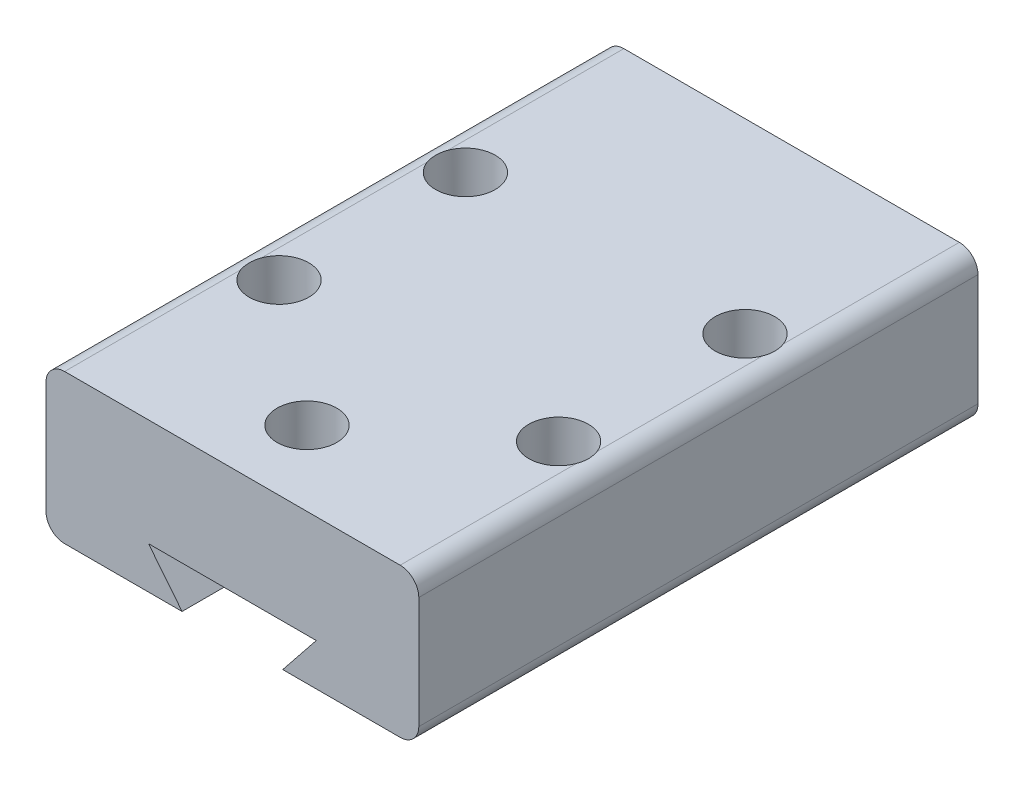
ISO-10303-21;
HEADER;
FILE_DESCRIPTION(('STEP AP214'),'2;1');
FILE_NAME('part.step','',(''),(''),'','','');
FILE_SCHEMA(('AUTOMOTIVE_DESIGN { 1 0 10303 214 1 1 1 1 }'));
ENDSEC;
DATA;
#1=APPLICATION_CONTEXT('core data for automotive mechanical design processes');
#2=APPLICATION_PROTOCOL_DEFINITION('international standard','automotive_design',2000,#1);
#3=PRODUCT_CONTEXT('',#1,'mechanical');
#4=PRODUCT('Part','Part','',(#3));
#5=PRODUCT_RELATED_PRODUCT_CATEGORY('part','',(#4));
#6=PRODUCT_DEFINITION_FORMATION('','',#4);
#7=PRODUCT_DEFINITION_CONTEXT('part definition',#1,'design');
#8=PRODUCT_DEFINITION('design','',#6,#7);
#9=PRODUCT_DEFINITION_SHAPE('','',#8);
#10=(LENGTH_UNIT() NAMED_UNIT(*) SI_UNIT(.MILLI.,.METRE.));
#11=(NAMED_UNIT(*) PLANE_ANGLE_UNIT() SI_UNIT($,.RADIAN.));
#12=(NAMED_UNIT(*) SI_UNIT($,.STERADIAN.) SOLID_ANGLE_UNIT());
#13=UNCERTAINTY_MEASURE_WITH_UNIT(LENGTH_MEASURE(1.E-05),#10,'distance_accuracy_value','');
#14=(GEOMETRIC_REPRESENTATION_CONTEXT(3) GLOBAL_UNCERTAINTY_ASSIGNED_CONTEXT((#13)) GLOBAL_UNIT_ASSIGNED_CONTEXT((#10,
#11,#12)) REPRESENTATION_CONTEXT('',''));
#15=CARTESIAN_POINT('',(0.,0.,0.));
#16=DIRECTION('',(0.,0.,1.));
#17=DIRECTION('',(1.,0.,0.));
#18=AXIS2_PLACEMENT_3D('',#15,#16,#17);
#19=CARTESIAN_POINT('',(-34.1847696899817,16.7428577599907,30.));
#20=DIRECTION('',(1.,0.,0.));
#21=DIRECTION('',(0.,0.,-1.));
#22=AXIS2_PLACEMENT_3D('',#19,#20,#21);
#23=PLANE('',#22);
#24=DIRECTION('',(0.,-1.,0.));
#25=VECTOR('',#24,1.);
#26=CARTESIAN_POINT('',(-34.1847696899817,16.7428577599907,0.));
#27=LINE('',#26,#25);
#28=CARTESIAN_POINT('',(-34.1847696899817,23.7428577599907,0.));
#29=VERTEX_POINT('',#28);
#30=CARTESIAN_POINT('',(-34.1847696899817,17.7428577599907,0.));
#31=VERTEX_POINT('',#30);
#32=EDGE_CURVE('E313',#29,#31,#27,.T.);
#33=ORIENTED_EDGE('',*,*,#32,.T.);
#34=DIRECTION('',(0.,0.,-1.));
#35=VECTOR('',#34,1.);
#36=CARTESIAN_POINT('',(-34.1847696899817,17.7428577599907,30.));
#37=LINE('',#36,#35);
#38=CARTESIAN_POINT('',(-34.1847696899817,17.7428577599907,30.));
#39=VERTEX_POINT('',#38);
#40=EDGE_CURVE('E159',#31,#39,#37,.F.);
#41=ORIENTED_EDGE('',*,*,#40,.T.);
#42=DIRECTION('',(0.,-1.,0.));
#43=VECTOR('',#42,1.);
#44=CARTESIAN_POINT('',(-34.1847696899817,16.7428577599907,30.));
#45=LINE('',#44,#43);
#46=CARTESIAN_POINT('',(-34.1847696899817,23.7428577599907,30.));
#47=VERTEX_POINT('',#46);
#48=EDGE_CURVE('E245',#47,#39,#45,.T.);
#49=ORIENTED_EDGE('',*,*,#48,.F.);
#50=DIRECTION('',(0.,0.,-1.));
#51=VECTOR('',#50,1.);
#52=CARTESIAN_POINT('',(-34.1847696899817,23.7428577599907,30.));
#53=LINE('',#52,#51);
#54=EDGE_CURVE('E412',#47,#29,#53,.T.);
#55=ORIENTED_EDGE('',*,*,#54,.T.);
#56=EDGE_LOOP('',(#33,#41,#49,#55));
#57=FACE_BOUND('',#56,.T.);
#58=ADVANCED_FACE('F33',(#57),#23,.F.);
#59=CARTESIAN_POINT('',(-26.8847696899817,16.7428577599907,30.));
#60=DIRECTION('',(0.,1.,0.));
#61=DIRECTION('',(-1.,0.,0.));
#62=AXIS2_PLACEMENT_3D('',#59,#60,#61);
#63=PLANE('',#62);
#64=DIRECTION('',(1.,0.,0.));
#65=VECTOR('',#64,1.);
#66=CARTESIAN_POINT('',(-26.8847696899817,16.7428577599907,30.));
#67=LINE('',#66,#65);
#68=CARTESIAN_POINT('',(-33.1847696899817,16.7428577599907,30.));
#69=VERTEX_POINT('',#68);
#70=CARTESIAN_POINT('',(-26.8847696899817,16.7428577599907,30.));
#71=VERTEX_POINT('',#70);
#72=EDGE_CURVE('E249',#69,#71,#67,.T.);
#73=ORIENTED_EDGE('',*,*,#72,.F.);
#74=DIRECTION('',(0.,0.,-1.));
#75=VECTOR('',#74,1.);
#76=CARTESIAN_POINT('',(-33.1847696899817,16.7428577599907,30.));
#77=LINE('',#76,#75);
#78=CARTESIAN_POINT('',(-33.1847696899817,16.7428577599907,0.));
#79=VERTEX_POINT('',#78);
#80=EDGE_CURVE('E228',#69,#79,#77,.T.);
#81=ORIENTED_EDGE('',*,*,#80,.T.);
#82=DIRECTION('',(1.,0.,0.));
#83=VECTOR('',#82,1.);
#84=CARTESIAN_POINT('',(-26.8847696899817,16.7428577599907,0.));
#85=LINE('',#84,#83);
#86=CARTESIAN_POINT('',(-26.8847696899817,16.7428577599907,0.));
#87=VERTEX_POINT('',#86);
#88=EDGE_CURVE('E311',#79,#87,#85,.T.);
#89=ORIENTED_EDGE('',*,*,#88,.T.);
#90=DIRECTION('',(0.,0.,-1.));
#91=VECTOR('',#90,1.);
#92=CARTESIAN_POINT('',(-26.8847696899817,16.7428577599907,30.));
#93=LINE('',#92,#91);
#94=EDGE_CURVE('E265',#71,#87,#93,.T.);
#95=ORIENTED_EDGE('',*,*,#94,.F.);
#96=EDGE_LOOP('',(#73,#81,#89,#95));
#97=FACE_BOUND('',#96,.T.);
#98=ADVANCED_FACE('F400',(#97),#63,.F.);
#99=CARTESIAN_POINT('',(-28.6847696899817,18.9928577599907,30.));
#100=DIRECTION('',(-0.78086880944303,-0.624695047554425,0.));
#101=DIRECTION('',(0.624695047554425,-0.78086880944303,0.));
#102=AXIS2_PLACEMENT_3D('',#99,#100,#101);
#103=PLANE('',#102);
#104=DIRECTION('',(-0.624695047554425,0.78086880944303,0.));
#105=VECTOR('',#104,1.);
#106=CARTESIAN_POINT('',(-28.6847696899817,18.9928577599907,0.));
#107=LINE('',#106,#105);
#108=CARTESIAN_POINT('',(-28.6847696899817,18.9928577599907,0.));
#109=VERTEX_POINT('',#108);
#110=EDGE_CURVE('E309',#87,#109,#107,.T.);
#111=ORIENTED_EDGE('',*,*,#110,.T.);
#112=DIRECTION('',(0.,0.,-1.));
#113=VECTOR('',#112,1.);
#114=CARTESIAN_POINT('',(-28.6847696899817,18.9928577599907,30.));
#115=LINE('',#114,#113);
#116=CARTESIAN_POINT('',(-28.6847696899817,18.9928577599907,30.));
#117=VERTEX_POINT('',#116);
#118=EDGE_CURVE('E262',#117,#109,#115,.T.);
#119=ORIENTED_EDGE('',*,*,#118,.F.);
#120=DIRECTION('',(-0.624695047554425,0.78086880944303,0.));
#121=VECTOR('',#120,1.);
#122=CARTESIAN_POINT('',(-28.6847696899817,18.9928577599907,30.));
#123=LINE('',#122,#121);
#124=EDGE_CURVE('E322',#71,#117,#123,.T.);
#125=ORIENTED_EDGE('',*,*,#124,.F.);
#126=ORIENTED_EDGE('',*,*,#94,.T.);
#127=EDGE_LOOP('',(#111,#119,#125,#126));
#128=FACE_BOUND('',#127,.T.);
#129=ADVANCED_FACE('F396',(#128),#103,.F.);
#130=CARTESIAN_POINT('',(-19.6847696899817,18.9928577599907,30.));
#131=DIRECTION('',(0.,1.,0.));
#132=DIRECTION('',(0.,0.,1.));
#133=AXIS2_PLACEMENT_3D('',#130,#131,#132);
#134=PLANE('',#133);
#135=DIRECTION('',(1.,0.,0.));
#136=VECTOR('',#135,1.);
#137=CARTESIAN_POINT('',(-19.6847696899817,18.9928577599907,0.));
#138=LINE('',#137,#136);
#139=CARTESIAN_POINT('',(-19.6847696899817,18.9928577599907,0.));
#140=VERTEX_POINT('',#139);
#141=EDGE_CURVE('E305',#109,#140,#138,.T.);
#142=ORIENTED_EDGE('',*,*,#141,.T.);
#143=DIRECTION('',(0.,0.,-1.));
#144=VECTOR('',#143,1.);
#145=CARTESIAN_POINT('',(-19.6847696899817,18.9928577599907,30.));
#146=LINE('',#145,#144);
#147=CARTESIAN_POINT('',(-19.6847696899817,18.9928577599907,30.));
#148=VERTEX_POINT('',#147);
#149=EDGE_CURVE('E258',#148,#140,#146,.T.);
#150=ORIENTED_EDGE('',*,*,#149,.F.);
#151=DIRECTION('',(1.,0.,0.));
#152=VECTOR('',#151,1.);
#153=CARTESIAN_POINT('',(-19.6847696899817,18.9928577599907,30.));
#154=LINE('',#153,#152);
#155=EDGE_CURVE('E320',#117,#148,#154,.T.);
#156=ORIENTED_EDGE('',*,*,#155,.F.);
#157=ORIENTED_EDGE('',*,*,#118,.T.);
#158=EDGE_LOOP('',(#142,#150,#156,#157));
#159=FACE_BOUND('',#158,.T.);
#160=ADVANCED_FACE('F392',(#159),#134,.F.);
#161=CARTESIAN_POINT('',(-21.4847696899817,16.7428577599907,30.));
#162=DIRECTION('',(0.780868809443031,-0.624695047554423,0.));
#163=DIRECTION('',(0.624695047554423,0.780868809443031,0.));
#164=AXIS2_PLACEMENT_3D('',#161,#162,#163);
#165=PLANE('',#164);
#166=DIRECTION('',(-0.624695047554423,-0.780868809443031,0.));
#167=VECTOR('',#166,1.);
#168=CARTESIAN_POINT('',(-21.4847696899817,16.7428577599907,0.));
#169=LINE('',#168,#167);
#170=CARTESIAN_POINT('',(-21.4847696899817,16.7428577599907,0.));
#171=VERTEX_POINT('',#170);
#172=EDGE_CURVE('E304',#140,#171,#169,.T.);
#173=ORIENTED_EDGE('',*,*,#172,.T.);
#174=DIRECTION('',(0.,0.,-1.));
#175=VECTOR('',#174,1.);
#176=CARTESIAN_POINT('',(-21.4847696899817,16.7428577599907,30.));
#177=LINE('',#176,#175);
#178=CARTESIAN_POINT('',(-21.4847696899817,16.7428577599907,30.));
#179=VERTEX_POINT('',#178);
#180=EDGE_CURVE('E255',#179,#171,#177,.T.);
#181=ORIENTED_EDGE('',*,*,#180,.F.);
#182=DIRECTION('',(-0.624695047554423,-0.780868809443031,0.));
#183=VECTOR('',#182,1.);
#184=CARTESIAN_POINT('',(-21.4847696899817,16.7428577599907,30.));
#185=LINE('',#184,#183);
#186=EDGE_CURVE('E318',#148,#179,#185,.T.);
#187=ORIENTED_EDGE('',*,*,#186,.F.);
#188=ORIENTED_EDGE('',*,*,#149,.T.);
#189=EDGE_LOOP('',(#173,#181,#187,#188));
#190=FACE_BOUND('',#189,.T.);
#191=ADVANCED_FACE('F389',(#190),#165,.F.);
#192=CARTESIAN_POINT('',(-14.1847696899817,16.7428577599907,30.));
#193=DIRECTION('',(0.,1.,0.));
#194=DIRECTION('',(0.,0.,1.));
#195=AXIS2_PLACEMENT_3D('',#192,#193,#194);
#196=PLANE('',#195);
#197=DIRECTION('',(1.,0.,0.));
#198=VECTOR('',#197,1.);
#199=CARTESIAN_POINT('',(-14.1847696899817,16.7428577599907,0.));
#200=LINE('',#199,#198);
#201=CARTESIAN_POINT('',(-15.1847696899817,16.7428577599907,0.));
#202=VERTEX_POINT('',#201);
#203=EDGE_CURVE('E251',#171,#202,#200,.T.);
#204=ORIENTED_EDGE('',*,*,#203,.T.);
#205=DIRECTION('',(0.,0.,-1.));
#206=VECTOR('',#205,1.);
#207=CARTESIAN_POINT('',(-15.1847696899817,16.7428577599907,30.));
#208=LINE('',#207,#206);
#209=CARTESIAN_POINT('',(-15.1847696899817,16.7428577599907,30.));
#210=VERTEX_POINT('',#209);
#211=EDGE_CURVE('E275',#202,#210,#208,.F.);
#212=ORIENTED_EDGE('',*,*,#211,.T.);
#213=DIRECTION('',(1.,0.,0.));
#214=VECTOR('',#213,1.);
#215=CARTESIAN_POINT('',(-14.1847696899817,16.7428577599907,30.));
#216=LINE('',#215,#214);
#217=EDGE_CURVE('E291',#179,#210,#216,.T.);
#218=ORIENTED_EDGE('',*,*,#217,.F.);
#219=ORIENTED_EDGE('',*,*,#180,.T.);
#220=EDGE_LOOP('',(#204,#212,#218,#219));
#221=FACE_BOUND('',#220,.T.);
#222=ADVANCED_FACE('F302',(#221),#196,.F.);
#223=CARTESIAN_POINT('',(-14.1847696899817,24.7428577599907,30.));
#224=DIRECTION('',(-1.,0.,0.));
#225=DIRECTION('',(0.,-1.,0.));
#226=AXIS2_PLACEMENT_3D('',#223,#224,#225);
#227=PLANE('',#226);
#228=DIRECTION('',(0.,1.,0.));
#229=VECTOR('',#228,1.);
#230=CARTESIAN_POINT('',(-14.1847696899817,24.7428577599907,30.));
#231=LINE('',#230,#229);
#232=CARTESIAN_POINT('',(-14.1847696899817,17.7428577599907,30.));
#233=VERTEX_POINT('',#232);
#234=CARTESIAN_POINT('',(-14.1847696899817,23.7428577599907,30.));
#235=VERTEX_POINT('',#234);
#236=EDGE_CURVE('E289',#233,#235,#231,.T.);
#237=ORIENTED_EDGE('',*,*,#236,.F.);
#238=DIRECTION('',(0.,0.,-1.));
#239=VECTOR('',#238,1.);
#240=CARTESIAN_POINT('',(-14.1847696899817,17.7428577599907,30.));
#241=LINE('',#240,#239);
#242=CARTESIAN_POINT('',(-14.1847696899817,17.7428577599907,0.));
#243=VERTEX_POINT('',#242);
#244=EDGE_CURVE('E269',#233,#243,#241,.T.);
#245=ORIENTED_EDGE('',*,*,#244,.T.);
#246=DIRECTION('',(0.,1.,0.));
#247=VECTOR('',#246,1.);
#248=CARTESIAN_POINT('',(-14.1847696899817,24.7428577599907,0.));
#249=LINE('',#248,#247);
#250=CARTESIAN_POINT('',(-14.1847696899817,23.7428577599907,0.));
#251=VERTEX_POINT('',#250);
#252=EDGE_CURVE('E246',#243,#251,#249,.T.);
#253=ORIENTED_EDGE('',*,*,#252,.T.);
#254=DIRECTION('',(0.,0.,-1.));
#255=VECTOR('',#254,1.);
#256=CARTESIAN_POINT('',(-14.1847696899817,23.7428577599907,30.));
#257=LINE('',#256,#255);
#258=EDGE_CURVE('E235',#251,#235,#257,.F.);
#259=ORIENTED_EDGE('',*,*,#258,.T.);
#260=EDGE_LOOP('',(#237,#245,#253,#259));
#261=FACE_BOUND('',#260,.T.);
#262=ADVANCED_FACE('F296',(#261),#227,.F.);
#263=CARTESIAN_POINT('',(-34.1847696899817,24.7428577599907,30.));
#264=DIRECTION('',(0.,-1.,0.));
#265=DIRECTION('',(0.,0.,-1.));
#266=AXIS2_PLACEMENT_3D('',#263,#264,#265);
#267=PLANE('',#266);
#268=CARTESIAN_POINT('',(-24.1847696899817,24.7428577599907,26.));
#269=DIRECTION('',(0.,1.,0.));
#270=DIRECTION('',(0.,0.,1.));
#271=AXIS2_PLACEMENT_3D('',#268,#269,#270);
#272=CIRCLE('',#271,1.6);
#273=CARTESIAN_POINT('',(-24.1847696899817,24.7428577599907,27.6));
#274=VERTEX_POINT('',#273);
#275=EDGE_CURVE('E445',#274,#274,#272,.T.);
#276=ORIENTED_EDGE('',*,*,#275,.F.);
#277=EDGE_LOOP('',(#276));
#278=FACE_BOUND('',#277,.T.);
#279=DIRECTION('',(0.,0.,-1.));
#280=VECTOR('',#279,1.);
#281=CARTESIAN_POINT('',(-33.1847696899817,24.7428577599907,30.));
#282=LINE('',#281,#280);
#283=CARTESIAN_POINT('',(-33.1847696899817,24.7428577599907,10.556776436283));
#284=VERTEX_POINT('',#283);
#285=CARTESIAN_POINT('',(-33.1847696899817,24.7428577599907,19.443223563717));
#286=VERTEX_POINT('',#285);
#287=EDGE_CURVE('E166',#284,#286,#282,.F.);
#288=ORIENTED_EDGE('',*,*,#287,.T.);
#289=CARTESIAN_POINT('',(-31.6847696899817,24.7428577599907,20.));
#290=DIRECTION('',(0.,1.,0.));
#291=DIRECTION('',(0.,0.,1.));
#292=AXIS2_PLACEMENT_3D('',#289,#290,#291);
#293=CIRCLE('',#292,1.6);
#294=CARTESIAN_POINT('',(-33.1847696899817,24.7428577599907,20.556776436283));
#295=VERTEX_POINT('',#294);
#296=EDGE_CURVE('E349',#295,#286,#293,.T.);
#297=ORIENTED_EDGE('',*,*,#296,.F.);
#298=CARTESIAN_POINT('',(-33.1847696899817,24.7428577599907,30.));
#299=VERTEX_POINT('',#298);
#300=EDGE_CURVE('E175',#295,#299,#282,.F.);
#301=ORIENTED_EDGE('',*,*,#300,.T.);
#302=DIRECTION('',(-1.,0.,0.));
#303=VECTOR('',#302,1.);
#304=CARTESIAN_POINT('',(-34.1847696899817,24.7428577599907,30.));
#305=LINE('',#304,#303);
#306=CARTESIAN_POINT('',(-15.1847696899817,24.7428577599907,30.));
#307=VERTEX_POINT('',#306);
#308=EDGE_CURVE('E259',#307,#299,#305,.T.);
#309=ORIENTED_EDGE('',*,*,#308,.F.);
#310=DIRECTION('',(0.,0.,-1.));
#311=VECTOR('',#310,1.);
#312=CARTESIAN_POINT('',(-15.1847696899817,24.7428577599907,30.));
#313=LINE('',#312,#311);
#314=CARTESIAN_POINT('',(-15.1847696899817,24.7428577599907,20.556776436283));
#315=VERTEX_POINT('',#314);
#316=EDGE_CURVE('E202',#307,#315,#313,.T.);
#317=ORIENTED_EDGE('',*,*,#316,.T.);
#318=CARTESIAN_POINT('',(-16.6847696899817,24.7428577599907,20.));
#319=DIRECTION('',(0.,1.,0.));
#320=DIRECTION('',(0.,0.,1.));
#321=AXIS2_PLACEMENT_3D('',#318,#319,#320);
#322=CIRCLE('',#321,1.6);
#323=CARTESIAN_POINT('',(-15.1847696899817,24.7428577599907,19.443223563717));
#324=VERTEX_POINT('',#323);
#325=EDGE_CURVE('E56',#324,#315,#322,.T.);
#326=ORIENTED_EDGE('',*,*,#325,.F.);
#327=CARTESIAN_POINT('',(-15.1847696899817,24.7428577599907,10.556776436283));
#328=VERTEX_POINT('',#327);
#329=EDGE_CURVE('E227',#324,#328,#313,.T.);
#330=ORIENTED_EDGE('',*,*,#329,.T.);
#331=CARTESIAN_POINT('',(-16.6847696899817,24.7428577599907,10.));
#332=DIRECTION('',(0.,1.,0.));
#333=DIRECTION('',(0.,0.,1.));
#334=AXIS2_PLACEMENT_3D('',#331,#332,#333);
#335=CIRCLE('',#334,1.6);
#336=CARTESIAN_POINT('',(-15.1847696899817,24.7428577599907,9.44322356371699));
#337=VERTEX_POINT('',#336);
#338=EDGE_CURVE('E49',#337,#328,#335,.T.);
#339=ORIENTED_EDGE('',*,*,#338,.F.);
#340=CARTESIAN_POINT('',(-15.1847696899817,24.7428577599907,0.));
#341=VERTEX_POINT('',#340);
#342=EDGE_CURVE('E38',#337,#341,#313,.T.);
#343=ORIENTED_EDGE('',*,*,#342,.T.);
#344=DIRECTION('',(-1.,0.,0.));
#345=VECTOR('',#344,1.);
#346=CARTESIAN_POINT('',(-34.1847696899817,24.7428577599907,0.));
#347=LINE('',#346,#345);
#348=CARTESIAN_POINT('',(-33.1847696899817,24.7428577599907,0.));
#349=VERTEX_POINT('',#348);
#350=EDGE_CURVE('E231',#341,#349,#347,.T.);
#351=ORIENTED_EDGE('',*,*,#350,.T.);
#352=CARTESIAN_POINT('',(-33.1847696899817,24.7428577599907,9.443223563717));
#353=VERTEX_POINT('',#352);
#354=EDGE_CURVE('E168',#349,#353,#282,.F.);
#355=ORIENTED_EDGE('',*,*,#354,.T.);
#356=CARTESIAN_POINT('',(-31.6847696899817,24.7428577599907,10.));
#357=DIRECTION('',(0.,1.,0.));
#358=DIRECTION('',(0.,0.,1.));
#359=AXIS2_PLACEMENT_3D('',#356,#357,#358);
#360=CIRCLE('',#359,1.6);
#361=EDGE_CURVE('E152',#284,#353,#360,.T.);
#362=ORIENTED_EDGE('',*,*,#361,.F.);
#363=EDGE_LOOP('',(#288,#297,#301,#309,#317,#326,#330,#339,#343,#351,#355,#362));
#364=FACE_BOUND('',#363,.T.);
#365=ADVANCED_FACE('F164',(#278,#364),#267,.F.);
#366=CARTESIAN_POINT('',(0.,0.,30.));
#367=DIRECTION('',(0.,0.,-1.));
#368=DIRECTION('',(-1.,0.,0.));
#369=AXIS2_PLACEMENT_3D('',#366,#367,#368);
#370=PLANE('',#369);
#371=ORIENTED_EDGE('',*,*,#217,.T.);
#372=CARTESIAN_POINT('',(-15.1847696899817,17.7428577599907,30.));
#373=DIRECTION('',(0.,0.,-1.));
#374=DIRECTION('',(-1.,0.,0.));
#375=AXIS2_PLACEMENT_3D('',#372,#373,#374);
#376=CIRCLE('',#375,1.);
#377=EDGE_CURVE('E178',#210,#233,#376,.F.);
#378=ORIENTED_EDGE('',*,*,#377,.T.);
#379=ORIENTED_EDGE('',*,*,#236,.T.);
#380=CARTESIAN_POINT('',(-15.1847696899817,23.7428577599907,30.));
#381=DIRECTION('',(0.,0.,-1.));
#382=DIRECTION('',(-1.,0.,0.));
#383=AXIS2_PLACEMENT_3D('',#380,#381,#382);
#384=CIRCLE('',#383,1.);
#385=EDGE_CURVE('E280',#235,#307,#384,.F.);
#386=ORIENTED_EDGE('',*,*,#385,.T.);
#387=ORIENTED_EDGE('',*,*,#308,.T.);
#388=CARTESIAN_POINT('',(-33.1847696899817,23.7428577599907,30.));
#389=DIRECTION('',(0.,0.,-1.));
#390=DIRECTION('',(-1.,0.,0.));
#391=AXIS2_PLACEMENT_3D('',#388,#389,#390);
#392=CIRCLE('',#391,1.);
#393=EDGE_CURVE('E277',#299,#47,#392,.F.);
#394=ORIENTED_EDGE('',*,*,#393,.T.);
#395=ORIENTED_EDGE('',*,*,#48,.T.);
#396=CARTESIAN_POINT('',(-33.1847696899817,17.7428577599907,30.));
#397=DIRECTION('',(0.,0.,-1.));
#398=DIRECTION('',(-1.,0.,0.));
#399=AXIS2_PLACEMENT_3D('',#396,#397,#398);
#400=CIRCLE('',#399,1.);
#401=EDGE_CURVE('E279',#39,#69,#400,.F.);
#402=ORIENTED_EDGE('',*,*,#401,.T.);
#403=ORIENTED_EDGE('',*,*,#72,.T.);
#404=ORIENTED_EDGE('',*,*,#124,.T.);
#405=ORIENTED_EDGE('',*,*,#155,.T.);
#406=ORIENTED_EDGE('',*,*,#186,.T.);
#407=EDGE_LOOP('',(#371,#378,#379,#386,#387,#394,#395,#402,#403,#404,#405,#406));
#408=FACE_BOUND('',#407,.T.);
#409=ADVANCED_FACE('F288',(#408),#370,.F.);
#410=CARTESIAN_POINT('',(0.,0.,0.));
#411=DIRECTION('',(0.,0.,-1.));
#412=DIRECTION('',(-1.,0.,0.));
#413=AXIS2_PLACEMENT_3D('',#410,#411,#412);
#414=PLANE('',#413);
#415=ORIENTED_EDGE('',*,*,#252,.F.);
#416=CARTESIAN_POINT('',(-15.1847696899817,17.7428577599907,0.));
#417=DIRECTION('',(0.,0.,-1.));
#418=DIRECTION('',(-1.,0.,0.));
#419=AXIS2_PLACEMENT_3D('',#416,#417,#418);
#420=CIRCLE('',#419,1.);
#421=EDGE_CURVE('E239',#243,#202,#420,.T.);
#422=ORIENTED_EDGE('',*,*,#421,.T.);
#423=ORIENTED_EDGE('',*,*,#203,.F.);
#424=ORIENTED_EDGE('',*,*,#172,.F.);
#425=ORIENTED_EDGE('',*,*,#141,.F.);
#426=ORIENTED_EDGE('',*,*,#110,.F.);
#427=ORIENTED_EDGE('',*,*,#88,.F.);
#428=CARTESIAN_POINT('',(-33.1847696899817,17.7428577599907,0.));
#429=DIRECTION('',(0.,0.,-1.));
#430=DIRECTION('',(-1.,0.,0.));
#431=AXIS2_PLACEMENT_3D('',#428,#429,#430);
#432=CIRCLE('',#431,1.);
#433=EDGE_CURVE('E240',#79,#31,#432,.T.);
#434=ORIENTED_EDGE('',*,*,#433,.T.);
#435=ORIENTED_EDGE('',*,*,#32,.F.);
#436=CARTESIAN_POINT('',(-33.1847696899817,23.7428577599907,0.));
#437=DIRECTION('',(0.,0.,-1.));
#438=DIRECTION('',(-1.,0.,0.));
#439=AXIS2_PLACEMENT_3D('',#436,#437,#438);
#440=CIRCLE('',#439,1.);
#441=EDGE_CURVE('E244',#29,#349,#440,.T.);
#442=ORIENTED_EDGE('',*,*,#441,.T.);
#443=ORIENTED_EDGE('',*,*,#350,.F.);
#444=CARTESIAN_POINT('',(-15.1847696899817,23.7428577599907,0.));
#445=DIRECTION('',(0.,0.,-1.));
#446=DIRECTION('',(-1.,0.,0.));
#447=AXIS2_PLACEMENT_3D('',#444,#445,#446);
#448=CIRCLE('',#447,1.);
#449=EDGE_CURVE('E233',#341,#251,#448,.T.);
#450=ORIENTED_EDGE('',*,*,#449,.T.);
#451=EDGE_LOOP('',(#415,#422,#423,#424,#425,#426,#427,#434,#435,#442,#443,#450));
#452=FACE_BOUND('',#451,.T.);
#453=ADVANCED_FACE('F242',(#452),#414,.T.);
#454=CARTESIAN_POINT('',(-15.1847696899817,17.7428577599907,30.));
#455=DIRECTION('',(0.,0.,-1.));
#456=DIRECTION('',(-1.,0.,0.));
#457=AXIS2_PLACEMENT_3D('',#454,#455,#456);
#458=CYLINDRICAL_SURFACE('',#457,1.);
#459=ORIENTED_EDGE('',*,*,#377,.F.);
#460=ORIENTED_EDGE('',*,*,#211,.F.);
#461=ORIENTED_EDGE('',*,*,#421,.F.);
#462=ORIENTED_EDGE('',*,*,#244,.F.);
#463=EDGE_LOOP('',(#459,#460,#461,#462));
#464=FACE_BOUND('',#463,.T.);
#465=ADVANCED_FACE('F214',(#464),#458,.T.);
#466=CARTESIAN_POINT('',(-15.1847696899817,23.7428577599907,30.));
#467=DIRECTION('',(0.,0.,-1.));
#468=DIRECTION('',(-1.,0.,0.));
#469=AXIS2_PLACEMENT_3D('',#466,#467,#468);
#470=CYLINDRICAL_SURFACE('',#469,1.);
#471=CARTESIAN_POINT('',(-15.1847696899817,24.7428577599907,10.556776436283));
#472=CARTESIAN_POINT('',(-15.1737694995023,24.742859203693,10.5271444626173));
#473=CARTESIAN_POINT('',(-15.1636496195927,24.7428120688457,10.4971858756654));
#474=CARTESIAN_POINT('',(-15.1452009890053,24.7426249747356,10.4367221737807));
#475=CARTESIAN_POINT('',(-15.1368722537805,24.7424850146719,10.4062170541353));
#476=CARTESIAN_POINT('',(-15.1220364835235,24.7421165997588,10.3447669703003));
#477=CARTESIAN_POINT('',(-15.1155294799252,24.7418881433825,10.3138219985309));
#478=CARTESIAN_POINT('',(-15.104359645487,24.7413210889233,10.2516010943849));
#479=CARTESIAN_POINT('',(-15.0996968623784,24.74098248799,10.2203251534639));
#480=CARTESIAN_POINT('',(-15.0922319188639,24.7402774103376,10.1575516556884));
#481=CARTESIAN_POINT('',(-15.0894298226635,24.739910932657,10.1260540912243));
#482=CARTESIAN_POINT('',(-15.0856960584017,24.7388426744614,10.0629496073215));
#483=CARTESIAN_POINT('',(-15.0847644710127,24.7381408794863,10.0313426832251));
#484=CARTESIAN_POINT('',(-15.0847726870853,24.7376773582246,9.98179197432755));
#485=CARTESIAN_POINT('',(-15.0850775267623,24.7376403753521,9.96384918497853));
#486=CARTESIAN_POINT('',(-15.0861587702995,24.7377392176258,9.93187924791241));
#487=CARTESIAN_POINT('',(-15.0868183992236,24.7378392613209,9.91784789719659));
#488=CARTESIAN_POINT('',(-15.0887102677788,24.73809232474,9.88643035174835));
#489=CARTESIAN_POINT('',(-15.0900421608132,24.738252300415,9.86905014161228));
#490=CARTESIAN_POINT('',(-15.0935866717877,24.7386406144264,9.8309741407923));
#491=CARTESIAN_POINT('',(-15.0959200625507,24.7388761949526,9.81028961973942));
#492=CARTESIAN_POINT('',(-15.1018368312299,24.7394187484936,9.76567347807539));
#493=CARTESIAN_POINT('',(-15.1055617394715,24.7397311017417,9.74176057071822));
#494=CARTESIAN_POINT('',(-15.1137570168008,24.740335383575,9.69599959715042));
#495=CARTESIAN_POINT('',(-15.1181458522148,24.7406269893809,9.67413687596598));
#496=CARTESIAN_POINT('',(-15.1272724898817,24.7411505717287,9.63313344837506));
#497=CARTESIAN_POINT('',(-15.1319110577762,24.7413855431766,9.61397065466241));
#498=CARTESIAN_POINT('',(-15.1412396029315,24.7418011561412,9.5783267022262));
#499=CARTESIAN_POINT('',(-15.1458433145152,24.741984882941,9.5618229701887));
#500=CARTESIAN_POINT('',(-15.1548449544887,24.7422989635836,9.53144690206363));
#501=CARTESIAN_POINT('',(-15.1591693689638,24.7424331882513,9.51755276871904));
#502=CARTESIAN_POINT('',(-15.1703065616342,24.7427098388475,9.48341741240869));
#503=CARTESIAN_POINT('',(-15.1773372155324,24.7428267401101,9.46324688424388));
#504=CARTESIAN_POINT('',(-15.1847696899817,24.7428577599907,9.44322356371699));
#505=B_SPLINE_CURVE_WITH_KNOTS('',3,(#471,#472,#473,#474,#475,#476,#477,#478,#479,#480,#481,
#482,#483,#484,#485,#486,#487,#488,#489,#490,#491,#492,#493,#494,#495,#496,#497,#498,#499,#500,
#501,#502,#503,#504),.UNSPECIFIED.,.F.,.F.,(4,2,2,2,2,2,2,2,2,2,2,2,2,2,2,2,4),(0.,
0.0948094979763292,0.1896198138847,0.284431765642262,0.379246171123833,0.474063848140733,
0.568885614419631,0.622710625884528,0.66484750702838,0.717133774485319,0.779569228528668,
0.85215343057083,0.919036434912937,0.978175793489988,1.02957123088674,1.07322255472448,
1.13728947259164),.UNSPECIFIED.);
#506=EDGE_CURVE('E11',#328,#337,#505,.T.);
#507=ORIENTED_EDGE('',*,*,#506,.F.);
#508=ORIENTED_EDGE('',*,*,#329,.F.);
#509=CARTESIAN_POINT('',(-15.1847696899817,24.7428577599907,20.556776436283));
#510=CARTESIAN_POINT('',(-15.1737694995023,24.742859203693,20.5271444626173));
#511=CARTESIAN_POINT('',(-15.1636496195927,24.7428120688457,20.4971858756654));
#512=CARTESIAN_POINT('',(-15.1452009890053,24.7426249747356,20.4367221737807));
#513=CARTESIAN_POINT('',(-15.1368722537805,24.7424850146719,20.4062170541353));
#514=CARTESIAN_POINT('',(-15.1220364835235,24.7421165997588,20.3447669703003));
#515=CARTESIAN_POINT('',(-15.1155294799252,24.7418881433825,20.3138219985309));
#516=CARTESIAN_POINT('',(-15.104359645487,24.7413210889233,20.2516010943849));
#517=CARTESIAN_POINT('',(-15.0996968623784,24.74098248799,20.2203251534639));
#518=CARTESIAN_POINT('',(-15.0922319188639,24.7402774103376,20.1575516556884));
#519=CARTESIAN_POINT('',(-15.0894298226635,24.739910932657,20.1260540912243));
#520=CARTESIAN_POINT('',(-15.0856960584017,24.7388426744614,20.0629496073215));
#521=CARTESIAN_POINT('',(-15.0847644710127,24.7381408794863,20.0313426832251));
#522=CARTESIAN_POINT('',(-15.0847726870853,24.7376773582246,19.9817919743275));
#523=CARTESIAN_POINT('',(-15.0850775267623,24.7376403753521,19.9638491849785));
#524=CARTESIAN_POINT('',(-15.0861587702995,24.7377392176258,19.9318792479124));
#525=CARTESIAN_POINT('',(-15.0868183992236,24.7378392613209,19.9178478971966));
#526=CARTESIAN_POINT('',(-15.0887102677788,24.73809232474,19.8864303517483));
#527=CARTESIAN_POINT('',(-15.0900421608132,24.738252300415,19.8690501416123));
#528=CARTESIAN_POINT('',(-15.0935866717877,24.7386406144264,19.8309741407923));
#529=CARTESIAN_POINT('',(-15.0959200625507,24.7388761949526,19.8102896197394));
#530=CARTESIAN_POINT('',(-15.1018368312299,24.7394187484936,19.7656734780754));
#531=CARTESIAN_POINT('',(-15.1055617394715,24.7397311017417,19.7417605707182));
#532=CARTESIAN_POINT('',(-15.1137570168008,24.740335383575,19.6959995971504));
#533=CARTESIAN_POINT('',(-15.1181458522148,24.7406269893809,19.674136875966));
#534=CARTESIAN_POINT('',(-15.1272724898817,24.7411505717287,19.6331334483751));
#535=CARTESIAN_POINT('',(-15.1319110577762,24.7413855431766,19.6139706546624));
#536=CARTESIAN_POINT('',(-15.1412396029315,24.7418011561412,19.5783267022262));
#537=CARTESIAN_POINT('',(-15.1458433145152,24.741984882941,19.5618229701887));
#538=CARTESIAN_POINT('',(-15.1548449544887,24.7422989635836,19.5314469020636));
#539=CARTESIAN_POINT('',(-15.1591693689638,24.7424331882513,19.517552768719));
#540=CARTESIAN_POINT('',(-15.1703065616342,24.7427098388475,19.4834174124087));
#541=CARTESIAN_POINT('',(-15.1773372155324,24.7428267401101,19.4632468842439));
#542=CARTESIAN_POINT('',(-15.1847696899817,24.7428577599907,19.443223563717));
#543=B_SPLINE_CURVE_WITH_KNOTS('',3,(#509,#510,#511,#512,#513,#514,#515,#516,#517,#518,#519,
#520,#521,#522,#523,#524,#525,#526,#527,#528,#529,#530,#531,#532,#533,#534,#535,#536,#537,#538,
#539,#540,#541,#542),.UNSPECIFIED.,.F.,.F.,(4,2,2,2,2,2,2,2,2,2,2,2,2,2,2,2,4),(0.,
0.0948094979763297,0.1896198138847,0.284431765642262,0.379246171123832,0.474063848140731,
0.56888561441963,0.622710625884523,0.664847507028375,0.717133774485312,0.779569228528663,
0.852153430570824,0.91903643491293,0.978175793489982,1.02957123088673,1.07322255472447,
1.13728947259164),.UNSPECIFIED.);
#544=EDGE_CURVE('E44',#315,#324,#543,.T.);
#545=ORIENTED_EDGE('',*,*,#544,.F.);
#546=ORIENTED_EDGE('',*,*,#316,.F.);
#547=ORIENTED_EDGE('',*,*,#385,.F.);
#548=ORIENTED_EDGE('',*,*,#258,.F.);
#549=ORIENTED_EDGE('',*,*,#449,.F.);
#550=ORIENTED_EDGE('',*,*,#342,.F.);
#551=EDGE_LOOP('',(#507,#508,#545,#546,#547,#548,#549,#550));
#552=FACE_BOUND('',#551,.T.);
#553=ADVANCED_FACE('F204',(#552),#470,.T.);
#554=CARTESIAN_POINT('',(-33.1847696899817,17.7428577599907,30.));
#555=DIRECTION('',(0.,0.,-1.));
#556=DIRECTION('',(-1.,0.,0.));
#557=AXIS2_PLACEMENT_3D('',#554,#555,#556);
#558=CYLINDRICAL_SURFACE('',#557,1.);
#559=ORIENTED_EDGE('',*,*,#401,.F.);
#560=ORIENTED_EDGE('',*,*,#40,.F.);
#561=ORIENTED_EDGE('',*,*,#433,.F.);
#562=ORIENTED_EDGE('',*,*,#80,.F.);
#563=EDGE_LOOP('',(#559,#560,#561,#562));
#564=FACE_BOUND('',#563,.T.);
#565=ADVANCED_FACE('F213',(#564),#558,.T.);
#566=CARTESIAN_POINT('',(-33.1847696899817,23.7428577599907,30.));
#567=DIRECTION('',(0.,0.,-1.));
#568=DIRECTION('',(-1.,0.,0.));
#569=AXIS2_PLACEMENT_3D('',#566,#567,#568);
#570=CYLINDRICAL_SURFACE('',#569,1.);
#571=CARTESIAN_POINT('',(-33.1847696899817,24.7428577599907,19.443223563717));
#572=CARTESIAN_POINT('',(-33.1957698804612,24.742859203693,19.4728555373827));
#573=CARTESIAN_POINT('',(-33.2058897603707,24.7428120688457,19.5028141243346));
#574=CARTESIAN_POINT('',(-33.2243383909581,24.7426249747356,19.5632778262193));
#575=CARTESIAN_POINT('',(-33.2326671261829,24.7424850146719,19.5937829458648));
#576=CARTESIAN_POINT('',(-33.24750289644,24.7421165997588,19.6552330296997));
#577=CARTESIAN_POINT('',(-33.2540099000383,24.7418881433825,19.6861780014691));
#578=CARTESIAN_POINT('',(-33.2651797344765,24.7413210889233,19.7483989056151));
#579=CARTESIAN_POINT('',(-33.269842517585,24.74098248799,19.7796748465361));
#580=CARTESIAN_POINT('',(-33.2773074610996,24.7402774103376,19.8424483443116));
#581=CARTESIAN_POINT('',(-33.2801095572999,24.739910932657,19.8739459087757));
#582=CARTESIAN_POINT('',(-33.2838433215617,24.7388426744614,19.9370503926785));
#583=CARTESIAN_POINT('',(-33.2847749089507,24.7381408794863,19.9686573167749));
#584=CARTESIAN_POINT('',(-33.2847666928781,24.7376773582246,20.0182080256725));
#585=CARTESIAN_POINT('',(-33.2844618532011,24.7376403753521,20.0361508150215));
#586=CARTESIAN_POINT('',(-33.2833806096639,24.7377392176258,20.0681207520876));
#587=CARTESIAN_POINT('',(-33.2827209807399,24.7378392613209,20.0821521028034));
#588=CARTESIAN_POINT('',(-33.2808291121846,24.73809232474,20.1135696482516));
#589=CARTESIAN_POINT('',(-33.2794972191502,24.738252300415,20.1309498583877));
#590=CARTESIAN_POINT('',(-33.2759527081757,24.7386406144264,20.1690258592077));
#591=CARTESIAN_POINT('',(-33.2736193174127,24.7388761949526,20.1897103802606));
#592=CARTESIAN_POINT('',(-33.2677025487335,24.7394187484936,20.2343265219246));
#593=CARTESIAN_POINT('',(-33.2639776404919,24.7397311017417,20.2582394292818));
#594=CARTESIAN_POINT('',(-33.2557823631626,24.740335383575,20.3040004028496));
#595=CARTESIAN_POINT('',(-33.2513935277486,24.7406269893809,20.325863124034));
#596=CARTESIAN_POINT('',(-33.2422668900817,24.7411505717287,20.3668665516249));
#597=CARTESIAN_POINT('',(-33.2376283221872,24.7413855431766,20.3860293453376));
#598=CARTESIAN_POINT('',(-33.228299777032,24.7418011561412,20.4216732977738));
#599=CARTESIAN_POINT('',(-33.2236960654482,24.741984882941,20.4381770298113));
#600=CARTESIAN_POINT('',(-33.2146944254748,24.7422989635836,20.4685530979364));
#601=CARTESIAN_POINT('',(-33.2103700109996,24.7424331882513,20.482447231281));
#602=CARTESIAN_POINT('',(-33.1992328183292,24.7427098388475,20.5165825875913));
#603=CARTESIAN_POINT('',(-33.192202164431,24.7428267401101,20.5367531157561));
#604=CARTESIAN_POINT('',(-33.1847696899817,24.7428577599907,20.556776436283));
#605=B_SPLINE_CURVE_WITH_KNOTS('',3,(#571,#572,#573,#574,#575,#576,#577,#578,#579,#580,#581,
#582,#583,#584,#585,#586,#587,#588,#589,#590,#591,#592,#593,#594,#595,#596,#597,#598,#599,#600,
#601,#602,#603,#604),.UNSPECIFIED.,.F.,.F.,(4,2,2,2,2,2,2,2,2,2,2,2,2,2,2,2,4),(0.,
0.0948094979763297,0.189619813884696,0.284431765642259,0.379246171123828,0.474063848140723,
0.568885614419622,0.622710625884516,0.664847507028364,0.717133774485305,0.779569228528652,
0.852153430570812,0.919036434912923,0.97817579348997,1.02957123088672,1.07322255472446,
1.13728947259162),.UNSPECIFIED.);
#606=EDGE_CURVE('E158',#286,#295,#605,.T.);
#607=ORIENTED_EDGE('',*,*,#606,.F.);
#608=ORIENTED_EDGE('',*,*,#287,.F.);
#609=CARTESIAN_POINT('',(-33.1847696899817,24.7428577599907,9.443223563717));
#610=CARTESIAN_POINT('',(-33.1957698804612,24.742859203693,9.47285553738268));
#611=CARTESIAN_POINT('',(-33.2058897603707,24.7428120688457,9.50281412433464));
#612=CARTESIAN_POINT('',(-33.2243383909581,24.7426249747356,9.56327782621931));
#613=CARTESIAN_POINT('',(-33.2326671261829,24.7424850146719,9.59378294586476));
#614=CARTESIAN_POINT('',(-33.24750289644,24.7421165997588,9.65523302969967));
#615=CARTESIAN_POINT('',(-33.2540099000383,24.7418881433825,9.6861780014691));
#616=CARTESIAN_POINT('',(-33.2651797344765,24.7413210889233,9.74839890561507));
#617=CARTESIAN_POINT('',(-33.269842517585,24.74098248799,9.77967484653612));
#618=CARTESIAN_POINT('',(-33.2773074610996,24.7402774103376,9.84244834431165));
#619=CARTESIAN_POINT('',(-33.2801095572999,24.739910932657,9.87394590877568));
#620=CARTESIAN_POINT('',(-33.2838433215617,24.7388426744614,9.93705039267847));
#621=CARTESIAN_POINT('',(-33.2847749089507,24.7381408794863,9.96865731677488));
#622=CARTESIAN_POINT('',(-33.2847666928781,24.7376773582246,10.0182080256725));
#623=CARTESIAN_POINT('',(-33.2844618532011,24.7376403753521,10.0361508150215));
#624=CARTESIAN_POINT('',(-33.2833806096639,24.7377392176258,10.0681207520876));
#625=CARTESIAN_POINT('',(-33.2827209807399,24.7378392613209,10.0821521028034));
#626=CARTESIAN_POINT('',(-33.2808291121846,24.73809232474,10.1135696482517));
#627=CARTESIAN_POINT('',(-33.2794972191502,24.738252300415,10.1309498583877));
#628=CARTESIAN_POINT('',(-33.2759527081757,24.7386406144264,10.1690258592077));
#629=CARTESIAN_POINT('',(-33.2736193174127,24.7388761949526,10.1897103802606));
#630=CARTESIAN_POINT('',(-33.2677025487335,24.7394187484936,10.2343265219246));
#631=CARTESIAN_POINT('',(-33.2639776404919,24.7397311017417,10.2582394292818));
#632=CARTESIAN_POINT('',(-33.2557823631626,24.740335383575,10.3040004028496));
#633=CARTESIAN_POINT('',(-33.2513935277486,24.7406269893809,10.325863124034));
#634=CARTESIAN_POINT('',(-33.2422668900817,24.7411505717287,10.3668665516249));
#635=CARTESIAN_POINT('',(-33.2376283221872,24.7413855431766,10.3860293453376));
#636=CARTESIAN_POINT('',(-33.228299777032,24.7418011561412,10.4216732977738));
#637=CARTESIAN_POINT('',(-33.2236960654482,24.741984882941,10.4381770298113));
#638=CARTESIAN_POINT('',(-33.2146944254748,24.7422989635836,10.4685530979364));
#639=CARTESIAN_POINT('',(-33.2103700109996,24.7424331882513,10.482447231281));
#640=CARTESIAN_POINT('',(-33.1992328183292,24.7427098388475,10.5165825875913));
#641=CARTESIAN_POINT('',(-33.192202164431,24.7428267401101,10.5367531157561));
#642=CARTESIAN_POINT('',(-33.1847696899817,24.7428577599907,10.556776436283));
#643=B_SPLINE_CURVE_WITH_KNOTS('',3,(#609,#610,#611,#612,#613,#614,#615,#616,#617,#618,#619,
#620,#621,#622,#623,#624,#625,#626,#627,#628,#629,#630,#631,#632,#633,#634,#635,#636,#637,#638,
#639,#640,#641,#642),.UNSPECIFIED.,.F.,.F.,(4,2,2,2,2,2,2,2,2,2,2,2,2,2,2,2,4),(0.,
0.0948094979763297,0.189619813884698,0.284431765642261,0.37924617112383,0.474063848140727,
0.568885614419624,0.622710625884517,0.664847507028369,0.717133774485305,0.779569228528655,
0.852153430570816,0.919036434912923,0.978175793489973,1.02957123088672,1.07322255472446,
1.13728947259162),.UNSPECIFIED.);
#644=EDGE_CURVE('E147',#353,#284,#643,.T.);
#645=ORIENTED_EDGE('',*,*,#644,.F.);
#646=ORIENTED_EDGE('',*,*,#354,.F.);
#647=ORIENTED_EDGE('',*,*,#441,.F.);
#648=ORIENTED_EDGE('',*,*,#54,.F.);
#649=ORIENTED_EDGE('',*,*,#393,.F.);
#650=ORIENTED_EDGE('',*,*,#300,.F.);
#651=EDGE_LOOP('',(#607,#608,#645,#646,#647,#648,#649,#650));
#652=FACE_BOUND('',#651,.T.);
#653=ADVANCED_FACE('F35',(#652),#570,.T.);
#654=CARTESIAN_POINT('',(-31.6847696899817,20.7428577599907,10.));
#655=DIRECTION('',(0.,1.,0.));
#656=DIRECTION('',(0.,0.,1.));
#657=AXIS2_PLACEMENT_3D('',#654,#655,#656);
#658=CYLINDRICAL_SURFACE('',#657,1.6);
#659=ORIENTED_EDGE('',*,*,#644,.T.);
#660=ORIENTED_EDGE('',*,*,#361,.T.);
#661=EDGE_LOOP('',(#659,#660));
#662=FACE_BOUND('',#661,.T.);
#663=CARTESIAN_POINT('',(-31.6847696899817,20.7428577599907,10.));
#664=DIRECTION('',(0.,1.,0.));
#665=DIRECTION('',(0.,0.,1.));
#666=AXIS2_PLACEMENT_3D('',#663,#664,#665);
#667=CIRCLE('',#666,1.6);
#668=CARTESIAN_POINT('',(-31.6847696899817,20.7428577599907,11.6));
#669=VERTEX_POINT('',#668);
#670=EDGE_CURVE('E169',#669,#669,#667,.T.);
#671=ORIENTED_EDGE('',*,*,#670,.F.);
#672=EDGE_LOOP('',(#671));
#673=FACE_BOUND('',#672,.T.);
#674=ADVANCED_FACE('F150',(#662,#673),#658,.F.);
#675=CARTESIAN_POINT('',(-31.6847696899817,20.7428577599907,10.));
#676=DIRECTION('',(0.,1.,0.));
#677=DIRECTION('',(0.,0.,1.));
#678=AXIS2_PLACEMENT_3D('',#675,#676,#677);
#679=PLANE('',#678);
#680=ORIENTED_EDGE('',*,*,#670,.T.);
#681=EDGE_LOOP('',(#680));
#682=FACE_BOUND('',#681,.T.);
#683=ADVANCED_FACE('F362',(#682),#679,.T.);
#684=CARTESIAN_POINT('',(-31.6847696899817,20.7428577599907,20.));
#685=DIRECTION('',(0.,1.,0.));
#686=DIRECTION('',(0.,0.,1.));
#687=AXIS2_PLACEMENT_3D('',#684,#685,#686);
#688=CYLINDRICAL_SURFACE('',#687,1.6);
#689=ORIENTED_EDGE('',*,*,#606,.T.);
#690=ORIENTED_EDGE('',*,*,#296,.T.);
#691=EDGE_LOOP('',(#689,#690));
#692=FACE_BOUND('',#691,.T.);
#693=CARTESIAN_POINT('',(-31.6847696899817,20.7428577599907,20.));
#694=DIRECTION('',(0.,1.,0.));
#695=DIRECTION('',(0.,0.,1.));
#696=AXIS2_PLACEMENT_3D('',#693,#694,#695);
#697=CIRCLE('',#696,1.6);
#698=CARTESIAN_POINT('',(-31.6847696899817,20.7428577599907,21.6));
#699=VERTEX_POINT('',#698);
#700=EDGE_CURVE('E170',#699,#699,#697,.T.);
#701=ORIENTED_EDGE('',*,*,#700,.F.);
#702=EDGE_LOOP('',(#701));
#703=FACE_BOUND('',#702,.T.);
#704=ADVANCED_FACE('F351',(#692,#703),#688,.F.);
#705=CARTESIAN_POINT('',(-31.6847696899817,20.7428577599907,20.));
#706=DIRECTION('',(0.,1.,0.));
#707=DIRECTION('',(0.,0.,1.));
#708=AXIS2_PLACEMENT_3D('',#705,#706,#707);
#709=PLANE('',#708);
#710=ORIENTED_EDGE('',*,*,#700,.T.);
#711=EDGE_LOOP('',(#710));
#712=FACE_BOUND('',#711,.T.);
#713=ADVANCED_FACE('F361',(#712),#709,.T.);
#714=CARTESIAN_POINT('',(-16.6847696899817,20.7428577599907,20.));
#715=DIRECTION('',(0.,1.,0.));
#716=DIRECTION('',(0.,0.,1.));
#717=AXIS2_PLACEMENT_3D('',#714,#715,#716);
#718=CYLINDRICAL_SURFACE('',#717,1.6);
#719=ORIENTED_EDGE('',*,*,#544,.T.);
#720=ORIENTED_EDGE('',*,*,#325,.T.);
#721=EDGE_LOOP('',(#719,#720));
#722=FACE_BOUND('',#721,.T.);
#723=CARTESIAN_POINT('',(-16.6847696899817,20.7428577599907,20.));
#724=DIRECTION('',(0.,1.,0.));
#725=DIRECTION('',(0.,0.,1.));
#726=AXIS2_PLACEMENT_3D('',#723,#724,#725);
#727=CIRCLE('',#726,1.6);
#728=CARTESIAN_POINT('',(-16.6847696899817,20.7428577599907,21.6));
#729=VERTEX_POINT('',#728);
#730=EDGE_CURVE('E328',#729,#729,#727,.T.);
#731=ORIENTED_EDGE('',*,*,#730,.F.);
#732=EDGE_LOOP('',(#731));
#733=FACE_BOUND('',#732,.T.);
#734=ADVANCED_FACE('F459',(#722,#733),#718,.F.);
#735=CARTESIAN_POINT('',(-16.6847696899817,20.7428577599907,20.));
#736=DIRECTION('',(0.,1.,0.));
#737=DIRECTION('',(0.,0.,1.));
#738=AXIS2_PLACEMENT_3D('',#735,#736,#737);
#739=PLANE('',#738);
#740=ORIENTED_EDGE('',*,*,#730,.T.);
#741=EDGE_LOOP('',(#740));
#742=FACE_BOUND('',#741,.T.);
#743=ADVANCED_FACE('F372',(#742),#739,.T.);
#744=CARTESIAN_POINT('',(-16.6847696899817,20.7428577599907,10.));
#745=DIRECTION('',(0.,1.,0.));
#746=DIRECTION('',(0.,0.,1.));
#747=AXIS2_PLACEMENT_3D('',#744,#745,#746);
#748=CYLINDRICAL_SURFACE('',#747,1.6);
#749=ORIENTED_EDGE('',*,*,#506,.T.);
#750=ORIENTED_EDGE('',*,*,#338,.T.);
#751=EDGE_LOOP('',(#749,#750));
#752=FACE_BOUND('',#751,.T.);
#753=CARTESIAN_POINT('',(-16.6847696899817,20.7428577599907,10.));
#754=DIRECTION('',(0.,1.,0.));
#755=DIRECTION('',(0.,0.,1.));
#756=AXIS2_PLACEMENT_3D('',#753,#754,#755);
#757=CIRCLE('',#756,1.6);
#758=CARTESIAN_POINT('',(-16.6847696899817,20.7428577599907,11.6));
#759=VERTEX_POINT('',#758);
#760=EDGE_CURVE('E327',#759,#759,#757,.T.);
#761=ORIENTED_EDGE('',*,*,#760,.F.);
#762=EDGE_LOOP('',(#761));
#763=FACE_BOUND('',#762,.T.);
#764=ADVANCED_FACE('F367',(#752,#763),#748,.F.);
#765=CARTESIAN_POINT('',(-16.6847696899817,20.7428577599907,10.));
#766=DIRECTION('',(0.,1.,0.));
#767=DIRECTION('',(0.,0.,1.));
#768=AXIS2_PLACEMENT_3D('',#765,#766,#767);
#769=PLANE('',#768);
#770=ORIENTED_EDGE('',*,*,#760,.T.);
#771=EDGE_LOOP('',(#770));
#772=FACE_BOUND('',#771,.T.);
#773=ADVANCED_FACE('F364',(#772),#769,.T.);
#774=CARTESIAN_POINT('',(-24.1847696899817,20.7428577599907,26.));
#775=DIRECTION('',(0.,1.,0.));
#776=DIRECTION('',(0.,0.,1.));
#777=AXIS2_PLACEMENT_3D('',#774,#775,#776);
#778=CYLINDRICAL_SURFACE('',#777,1.6);
#779=CARTESIAN_POINT('',(-24.1847696899817,20.7428577599907,26.));
#780=DIRECTION('',(0.,1.,0.));
#781=DIRECTION('',(0.,0.,1.));
#782=AXIS2_PLACEMENT_3D('',#779,#780,#781);
#783=CIRCLE('',#782,1.6);
#784=CARTESIAN_POINT('',(-24.1847696899817,20.7428577599907,27.6));
#785=VERTEX_POINT('',#784);
#786=EDGE_CURVE('E449',#785,#785,#783,.T.);
#787=ORIENTED_EDGE('',*,*,#786,.F.);
#788=EDGE_LOOP('',(#787));
#789=FACE_BOUND('',#788,.T.);
#790=ORIENTED_EDGE('',*,*,#275,.T.);
#791=EDGE_LOOP('',(#790));
#792=FACE_BOUND('',#791,.T.);
#793=ADVANCED_FACE('F366',(#789,#792),#778,.F.);
#794=CARTESIAN_POINT('',(-24.1847696899817,20.7428577599907,26.));
#795=DIRECTION('',(0.,1.,0.));
#796=DIRECTION('',(0.,0.,1.));
#797=AXIS2_PLACEMENT_3D('',#794,#795,#796);
#798=PLANE('',#797);
#799=ORIENTED_EDGE('',*,*,#786,.T.);
#800=EDGE_LOOP('',(#799));
#801=FACE_BOUND('',#800,.T.);
#802=ADVANCED_FACE('F469',(#801),#798,.T.);
#803=CLOSED_SHELL('',(#58,#98,#129,#160,#191,#222,#262,#365,#409,#453,#465,#553,#565,#653,#674,
#683,#704,#713,#734,#743,#764,#773,#793,#802));
#804=MANIFOLD_SOLID_BREP('B2',#803);
#805=ADVANCED_BREP_SHAPE_REPRESENTATION('',(#18,#804),#14);
#806=SHAPE_DEFINITION_REPRESENTATION(#9,#805);
ENDSEC;
END-ISO-10303-21;
